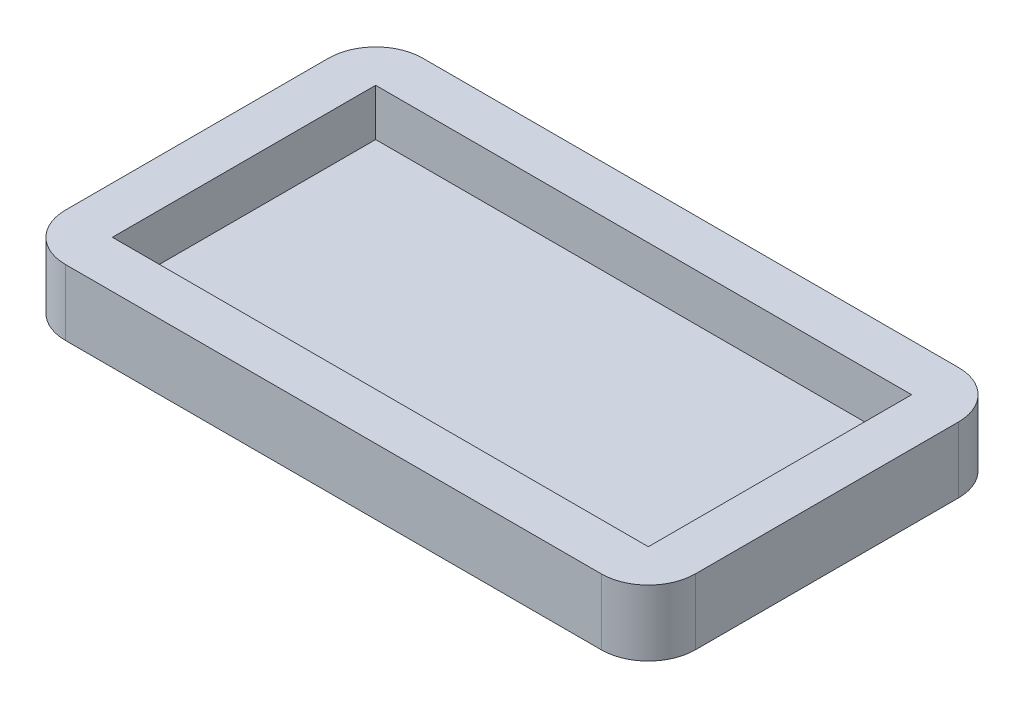
ISO-10303-21;
HEADER;
FILE_DESCRIPTION(('STEP AP214'),'2;1');
FILE_NAME('part.step','',(''),(''),'','','');
FILE_SCHEMA(('AUTOMOTIVE_DESIGN { 1 0 10303 214 1 1 1 1 }'));
ENDSEC;
DATA;
#1=APPLICATION_CONTEXT('core data for automotive mechanical design processes');
#2=APPLICATION_PROTOCOL_DEFINITION('international standard','automotive_design',2000,#1);
#3=PRODUCT_CONTEXT('',#1,'mechanical');
#4=PRODUCT('Part','Part','',(#3));
#5=PRODUCT_RELATED_PRODUCT_CATEGORY('part','',(#4));
#6=PRODUCT_DEFINITION_FORMATION('','',#4);
#7=PRODUCT_DEFINITION_CONTEXT('part definition',#1,'design');
#8=PRODUCT_DEFINITION('design','',#6,#7);
#9=PRODUCT_DEFINITION_SHAPE('','',#8);
#10=(LENGTH_UNIT() NAMED_UNIT(*) SI_UNIT(.MILLI.,.METRE.));
#11=(NAMED_UNIT(*) PLANE_ANGLE_UNIT() SI_UNIT($,.RADIAN.));
#12=(NAMED_UNIT(*) SI_UNIT($,.STERADIAN.) SOLID_ANGLE_UNIT());
#13=UNCERTAINTY_MEASURE_WITH_UNIT(LENGTH_MEASURE(1.E-05),#10,'distance_accuracy_value','');
#14=(GEOMETRIC_REPRESENTATION_CONTEXT(3) GLOBAL_UNCERTAINTY_ASSIGNED_CONTEXT((#13)) GLOBAL_UNIT_ASSIGNED_CONTEXT((#10,
#11,#12)) REPRESENTATION_CONTEXT('',''));
#15=CARTESIAN_POINT('',(0.,0.,0.));
#16=DIRECTION('',(0.,0.,1.));
#17=DIRECTION('',(1.,0.,0.));
#18=AXIS2_PLACEMENT_3D('',#15,#16,#17);
#19=CARTESIAN_POINT('',(-38.6259379929306,7.,-12.3630930746685));
#20=DIRECTION('',(0.,-1.,0.));
#21=DIRECTION('',(0.,0.,-1.));
#22=AXIS2_PLACEMENT_3D('',#19,#20,#21);
#23=CYLINDRICAL_SURFACE('',#22,5.);
#24=CARTESIAN_POINT('',(-38.6259379929306,0.,-12.3630930746685));
#25=DIRECTION('',(0.,1.,0.));
#26=DIRECTION('',(0.,0.,1.));
#27=AXIS2_PLACEMENT_3D('',#24,#25,#26);
#28=CIRCLE('',#27,5.);
#29=CARTESIAN_POINT('',(-43.6259379929306,0.,-12.3630930746685));
#30=VERTEX_POINT('',#29);
#31=CARTESIAN_POINT('',(-38.6259379929306,0.,-17.3630930746685));
#32=VERTEX_POINT('',#31);
#33=EDGE_CURVE('E149',#30,#32,#28,.F.);
#34=ORIENTED_EDGE('',*,*,#33,.F.);
#35=DIRECTION('',(0.,-1.,0.));
#36=VECTOR('',#35,1.);
#37=CARTESIAN_POINT('',(-43.6259379929306,7.,-12.3630930746685));
#38=LINE('',#37,#36);
#39=CARTESIAN_POINT('',(-43.6259379929306,7.,-12.3630930746685));
#40=VERTEX_POINT('',#39);
#41=EDGE_CURVE('E11',#40,#30,#38,.T.);
#42=ORIENTED_EDGE('',*,*,#41,.F.);
#43=CARTESIAN_POINT('',(-38.6259379929306,7.,-12.3630930746685));
#44=DIRECTION('',(0.,1.,0.));
#45=DIRECTION('',(0.,0.,1.));
#46=AXIS2_PLACEMENT_3D('',#43,#44,#45);
#47=CIRCLE('',#46,5.);
#48=CARTESIAN_POINT('',(-38.6259379929306,7.,-17.3630930746685));
#49=VERTEX_POINT('',#48);
#50=EDGE_CURVE('E170',#40,#49,#47,.F.);
#51=ORIENTED_EDGE('',*,*,#50,.T.);
#52=DIRECTION('',(0.,-1.,0.));
#53=VECTOR('',#52,1.);
#54=CARTESIAN_POINT('',(-38.6259379929306,7.,-17.3630930746685));
#55=LINE('',#54,#53);
#56=EDGE_CURVE('E63',#49,#32,#55,.T.);
#57=ORIENTED_EDGE('',*,*,#56,.T.);
#58=EDGE_LOOP('',(#34,#42,#51,#57));
#59=FACE_BOUND('',#58,.T.);
#60=ADVANCED_FACE('F41',(#59),#23,.T.);
#61=CARTESIAN_POINT('',(-43.6259379929306,7.,0.));
#62=DIRECTION('',(1.,0.,0.));
#63=DIRECTION('',(0.,0.,-1.));
#64=AXIS2_PLACEMENT_3D('',#61,#62,#63);
#65=PLANE('',#64);
#66=DIRECTION('',(0.,0.,1.));
#67=VECTOR('',#66,1.);
#68=CARTESIAN_POINT('',(-43.6259379929306,0.,0.));
#69=LINE('',#68,#67);
#70=CARTESIAN_POINT('',(-43.6259379929306,0.,15.6369069253315));
#71=VERTEX_POINT('',#70);
#72=EDGE_CURVE('E151',#30,#71,#69,.T.);
#73=ORIENTED_EDGE('',*,*,#72,.T.);
#74=DIRECTION('',(0.,-1.,0.));
#75=VECTOR('',#74,1.);
#76=CARTESIAN_POINT('',(-43.6259379929306,7.,15.6369069253315));
#77=LINE('',#76,#75);
#78=CARTESIAN_POINT('',(-43.6259379929306,7.,15.6369069253315));
#79=VERTEX_POINT('',#78);
#80=EDGE_CURVE('E48',#79,#71,#77,.T.);
#81=ORIENTED_EDGE('',*,*,#80,.F.);
#82=DIRECTION('',(0.,0.,1.));
#83=VECTOR('',#82,1.);
#84=CARTESIAN_POINT('',(-43.6259379929306,7.,0.));
#85=LINE('',#84,#83);
#86=EDGE_CURVE('E197',#40,#79,#85,.T.);
#87=ORIENTED_EDGE('',*,*,#86,.F.);
#88=ORIENTED_EDGE('',*,*,#41,.T.);
#89=EDGE_LOOP('',(#73,#81,#87,#88));
#90=FACE_BOUND('',#89,.T.);
#91=ADVANCED_FACE('F275',(#90),#65,.F.);
#92=CARTESIAN_POINT('',(-38.6259379929306,7.,15.6369069253315));
#93=DIRECTION('',(0.,-1.,0.));
#94=DIRECTION('',(0.,0.,-1.));
#95=AXIS2_PLACEMENT_3D('',#92,#93,#94);
#96=CYLINDRICAL_SURFACE('',#95,5.);
#97=CARTESIAN_POINT('',(-38.6259379929306,0.,15.6369069253315));
#98=DIRECTION('',(0.,1.,0.));
#99=DIRECTION('',(0.,0.,1.));
#100=AXIS2_PLACEMENT_3D('',#97,#98,#99);
#101=CIRCLE('',#100,5.);
#102=CARTESIAN_POINT('',(-38.6259379929306,0.,20.6369069253315));
#103=VERTEX_POINT('',#102);
#104=EDGE_CURVE('E152',#71,#103,#101,.T.);
#105=ORIENTED_EDGE('',*,*,#104,.T.);
#106=DIRECTION('',(0.,-1.,0.));
#107=VECTOR('',#106,1.);
#108=CARTESIAN_POINT('',(-38.6259379929306,7.,20.6369069253315));
#109=LINE('',#108,#107);
#110=CARTESIAN_POINT('',(-38.6259379929306,7.,20.6369069253315));
#111=VERTEX_POINT('',#110);
#112=EDGE_CURVE('E173',#111,#103,#109,.T.);
#113=ORIENTED_EDGE('',*,*,#112,.F.);
#114=CARTESIAN_POINT('',(-38.6259379929306,7.,15.6369069253315));
#115=DIRECTION('',(0.,1.,0.));
#116=DIRECTION('',(0.,0.,1.));
#117=AXIS2_PLACEMENT_3D('',#114,#115,#116);
#118=CIRCLE('',#117,5.);
#119=EDGE_CURVE('E181',#79,#111,#118,.T.);
#120=ORIENTED_EDGE('',*,*,#119,.F.);
#121=ORIENTED_EDGE('',*,*,#80,.T.);
#122=EDGE_LOOP('',(#105,#113,#120,#121));
#123=FACE_BOUND('',#122,.T.);
#124=ADVANCED_FACE('F182',(#123),#96,.T.);
#125=CARTESIAN_POINT('',(0.,7.,20.6369069253315));
#126=DIRECTION('',(0.,0.,-1.));
#127=DIRECTION('',(-1.,0.,0.));
#128=AXIS2_PLACEMENT_3D('',#125,#126,#127);
#129=PLANE('',#128);
#130=DIRECTION('',(1.,0.,0.));
#131=VECTOR('',#130,1.);
#132=CARTESIAN_POINT('',(0.,0.,20.6369069253315));
#133=LINE('',#132,#131);
#134=CARTESIAN_POINT('',(18.3740620070691,0.,20.6369069253315));
#135=VERTEX_POINT('',#134);
#136=EDGE_CURVE('E156',#103,#135,#133,.T.);
#137=ORIENTED_EDGE('',*,*,#136,.T.);
#138=DIRECTION('',(0.,-1.,0.));
#139=VECTOR('',#138,1.);
#140=CARTESIAN_POINT('',(18.3740620070691,7.,20.6369069253315));
#141=LINE('',#140,#139);
#142=CARTESIAN_POINT('',(18.3740620070691,7.,20.6369069253315));
#143=VERTEX_POINT('',#142);
#144=EDGE_CURVE('E174',#143,#135,#141,.T.);
#145=ORIENTED_EDGE('',*,*,#144,.F.);
#146=DIRECTION('',(1.,0.,0.));
#147=VECTOR('',#146,1.);
#148=CARTESIAN_POINT('',(0.,7.,20.6369069253315));
#149=LINE('',#148,#147);
#150=EDGE_CURVE('E145',#111,#143,#149,.T.);
#151=ORIENTED_EDGE('',*,*,#150,.F.);
#152=ORIENTED_EDGE('',*,*,#112,.T.);
#153=EDGE_LOOP('',(#137,#145,#151,#152));
#154=FACE_BOUND('',#153,.T.);
#155=ADVANCED_FACE('F195',(#154),#129,.F.);
#156=CARTESIAN_POINT('',(18.3740620070691,7.,15.6369069253315));
#157=DIRECTION('',(0.,-1.,0.));
#158=DIRECTION('',(0.,0.,-1.));
#159=AXIS2_PLACEMENT_3D('',#156,#157,#158);
#160=CYLINDRICAL_SURFACE('',#159,5.);
#161=CARTESIAN_POINT('',(18.3740620070691,0.,15.6369069253315));
#162=DIRECTION('',(0.,1.,0.));
#163=DIRECTION('',(0.,0.,1.));
#164=AXIS2_PLACEMENT_3D('',#161,#162,#163);
#165=CIRCLE('',#164,5.);
#166=CARTESIAN_POINT('',(23.3740620070691,0.,15.6369069253315));
#167=VERTEX_POINT('',#166);
#168=EDGE_CURVE('E158',#135,#167,#165,.T.);
#169=ORIENTED_EDGE('',*,*,#168,.T.);
#170=DIRECTION('',(0.,-1.,0.));
#171=VECTOR('',#170,1.);
#172=CARTESIAN_POINT('',(23.3740620070691,7.,15.6369069253315));
#173=LINE('',#172,#171);
#174=CARTESIAN_POINT('',(23.3740620070691,7.,15.6369069253315));
#175=VERTEX_POINT('',#174);
#176=EDGE_CURVE('E126',#175,#167,#173,.T.);
#177=ORIENTED_EDGE('',*,*,#176,.F.);
#178=CARTESIAN_POINT('',(18.3740620070691,7.,15.6369069253315));
#179=DIRECTION('',(0.,1.,0.));
#180=DIRECTION('',(0.,0.,1.));
#181=AXIS2_PLACEMENT_3D('',#178,#179,#180);
#182=CIRCLE('',#181,5.);
#183=EDGE_CURVE('E143',#143,#175,#182,.T.);
#184=ORIENTED_EDGE('',*,*,#183,.F.);
#185=ORIENTED_EDGE('',*,*,#144,.T.);
#186=EDGE_LOOP('',(#169,#177,#184,#185));
#187=FACE_BOUND('',#186,.T.);
#188=ADVANCED_FACE('F193',(#187),#160,.T.);
#189=CARTESIAN_POINT('',(23.3740620070691,7.,0.));
#190=DIRECTION('',(1.,0.,0.));
#191=DIRECTION('',(0.,0.,-1.));
#192=AXIS2_PLACEMENT_3D('',#189,#190,#191);
#193=PLANE('',#192);
#194=DIRECTION('',(0.,0.,1.));
#195=VECTOR('',#194,1.);
#196=CARTESIAN_POINT('',(23.3740620070691,0.,0.));
#197=LINE('',#196,#195);
#198=CARTESIAN_POINT('',(23.3740620070691,0.,-12.3630930746685));
#199=VERTEX_POINT('',#198);
#200=EDGE_CURVE('E124',#199,#167,#197,.T.);
#201=ORIENTED_EDGE('',*,*,#200,.F.);
#202=DIRECTION('',(0.,-1.,0.));
#203=VECTOR('',#202,1.);
#204=CARTESIAN_POINT('',(23.3740620070691,7.,-12.3630930746685));
#205=LINE('',#204,#203);
#206=CARTESIAN_POINT('',(23.3740620070691,7.,-12.3630930746685));
#207=VERTEX_POINT('',#206);
#208=EDGE_CURVE('E120',#207,#199,#205,.T.);
#209=ORIENTED_EDGE('',*,*,#208,.F.);
#210=DIRECTION('',(0.,0.,1.));
#211=VECTOR('',#210,1.);
#212=CARTESIAN_POINT('',(23.3740620070691,7.,0.));
#213=LINE('',#212,#211);
#214=EDGE_CURVE('E125',#207,#175,#213,.T.);
#215=ORIENTED_EDGE('',*,*,#214,.T.);
#216=ORIENTED_EDGE('',*,*,#176,.T.);
#217=EDGE_LOOP('',(#201,#209,#215,#216));
#218=FACE_BOUND('',#217,.T.);
#219=ADVANCED_FACE('F117',(#218),#193,.T.);
#220=CARTESIAN_POINT('',(18.3740620070691,7.,-12.3630930746685));
#221=DIRECTION('',(0.,-1.,0.));
#222=DIRECTION('',(0.,0.,-1.));
#223=AXIS2_PLACEMENT_3D('',#220,#221,#222);
#224=CYLINDRICAL_SURFACE('',#223,5.);
#225=CARTESIAN_POINT('',(18.3740620070691,0.,-12.3630930746685));
#226=DIRECTION('',(0.,1.,0.));
#227=DIRECTION('',(0.,0.,1.));
#228=AXIS2_PLACEMENT_3D('',#225,#226,#227);
#229=CIRCLE('',#228,5.);
#230=CARTESIAN_POINT('',(18.3740620070691,0.,-17.3630930746685));
#231=VERTEX_POINT('',#230);
#232=EDGE_CURVE('E165',#199,#231,#229,.T.);
#233=ORIENTED_EDGE('',*,*,#232,.T.);
#234=DIRECTION('',(0.,-1.,0.));
#235=VECTOR('',#234,1.);
#236=CARTESIAN_POINT('',(18.3740620070691,7.,-17.3630930746685));
#237=LINE('',#236,#235);
#238=CARTESIAN_POINT('',(18.3740620070691,7.,-17.3630930746685));
#239=VERTEX_POINT('',#238);
#240=EDGE_CURVE('E129',#239,#231,#237,.T.);
#241=ORIENTED_EDGE('',*,*,#240,.F.);
#242=CARTESIAN_POINT('',(18.3740620070691,7.,-12.3630930746685));
#243=DIRECTION('',(0.,1.,0.));
#244=DIRECTION('',(0.,0.,1.));
#245=AXIS2_PLACEMENT_3D('',#242,#243,#244);
#246=CIRCLE('',#245,5.);
#247=EDGE_CURVE('E131',#207,#239,#246,.T.);
#248=ORIENTED_EDGE('',*,*,#247,.F.);
#249=ORIENTED_EDGE('',*,*,#208,.T.);
#250=EDGE_LOOP('',(#233,#241,#248,#249));
#251=FACE_BOUND('',#250,.T.);
#252=ADVANCED_FACE('F135',(#251),#224,.T.);
#253=CARTESIAN_POINT('',(0.,7.,-17.3630930746685));
#254=DIRECTION('',(0.,0.,-1.));
#255=DIRECTION('',(-1.,0.,0.));
#256=AXIS2_PLACEMENT_3D('',#253,#254,#255);
#257=PLANE('',#256);
#258=DIRECTION('',(1.,0.,0.));
#259=VECTOR('',#258,1.);
#260=CARTESIAN_POINT('',(0.,0.,-17.3630930746685));
#261=LINE('',#260,#259);
#262=EDGE_CURVE('E163',#32,#231,#261,.T.);
#263=ORIENTED_EDGE('',*,*,#262,.F.);
#264=ORIENTED_EDGE('',*,*,#56,.F.);
#265=DIRECTION('',(1.,0.,0.));
#266=VECTOR('',#265,1.);
#267=CARTESIAN_POINT('',(0.,7.,-17.3630930746685));
#268=LINE('',#267,#266);
#269=EDGE_CURVE('E137',#49,#239,#268,.T.);
#270=ORIENTED_EDGE('',*,*,#269,.T.);
#271=ORIENTED_EDGE('',*,*,#240,.T.);
#272=EDGE_LOOP('',(#263,#264,#270,#271));
#273=FACE_BOUND('',#272,.T.);
#274=ADVANCED_FACE('F198',(#273),#257,.T.);
#275=CARTESIAN_POINT('',(0.,7.,0.));
#276=DIRECTION('',(0.,1.,0.));
#277=DIRECTION('',(0.,0.,1.));
#278=AXIS2_PLACEMENT_3D('',#275,#276,#277);
#279=PLANE('',#278);
#280=DIRECTION('',(0.,0.,1.));
#281=VECTOR('',#280,1.);
#282=CARTESIAN_POINT('',(-38.6259379929306,7.,-12.3630930746685));
#283=LINE('',#282,#281);
#284=CARTESIAN_POINT('',(-38.6259379929306,7.,-12.3630930746685));
#285=VERTEX_POINT('',#284);
#286=CARTESIAN_POINT('',(-38.6259379929306,7.,15.6369069253315));
#287=VERTEX_POINT('',#286);
#288=EDGE_CURVE('E54',#285,#287,#283,.T.);
#289=ORIENTED_EDGE('',*,*,#288,.F.);
#290=DIRECTION('',(-1.,0.,0.));
#291=VECTOR('',#290,1.);
#292=CARTESIAN_POINT('',(-38.6259379929306,7.,-12.3630930746685));
#293=LINE('',#292,#291);
#294=CARTESIAN_POINT('',(18.3740620070694,7.,-12.3630930746685));
#295=VERTEX_POINT('',#294);
#296=EDGE_CURVE('E215',#295,#285,#293,.T.);
#297=ORIENTED_EDGE('',*,*,#296,.F.);
#298=DIRECTION('',(0.,0.,-1.));
#299=VECTOR('',#298,1.);
#300=CARTESIAN_POINT('',(18.3740620070694,7.,-12.3630930746685));
#301=LINE('',#300,#299);
#302=CARTESIAN_POINT('',(18.3740620070694,7.,15.6369069253315));
#303=VERTEX_POINT('',#302);
#304=EDGE_CURVE('E216',#303,#295,#301,.T.);
#305=ORIENTED_EDGE('',*,*,#304,.F.);
#306=DIRECTION('',(1.,0.,0.));
#307=VECTOR('',#306,1.);
#308=CARTESIAN_POINT('',(-38.6259379929306,7.,15.6369069253315));
#309=LINE('',#308,#307);
#310=EDGE_CURVE('E218',#287,#303,#309,.T.);
#311=ORIENTED_EDGE('',*,*,#310,.F.);
#312=EDGE_LOOP('',(#289,#297,#305,#311));
#313=FACE_BOUND('',#312,.T.);
#314=ORIENTED_EDGE('',*,*,#50,.F.);
#315=ORIENTED_EDGE('',*,*,#86,.T.);
#316=ORIENTED_EDGE('',*,*,#119,.T.);
#317=ORIENTED_EDGE('',*,*,#150,.T.);
#318=ORIENTED_EDGE('',*,*,#183,.T.);
#319=ORIENTED_EDGE('',*,*,#214,.F.);
#320=ORIENTED_EDGE('',*,*,#247,.T.);
#321=ORIENTED_EDGE('',*,*,#269,.F.);
#322=EDGE_LOOP('',(#314,#315,#316,#317,#318,#319,#320,#321));
#323=FACE_BOUND('',#322,.T.);
#324=ADVANCED_FACE('F136',(#313,#323),#279,.T.);
#325=CARTESIAN_POINT('',(0.,0.,0.));
#326=DIRECTION('',(0.,1.,0.));
#327=DIRECTION('',(0.,0.,1.));
#328=AXIS2_PLACEMENT_3D('',#325,#326,#327);
#329=PLANE('',#328);
#330=ORIENTED_EDGE('',*,*,#33,.T.);
#331=ORIENTED_EDGE('',*,*,#262,.T.);
#332=ORIENTED_EDGE('',*,*,#232,.F.);
#333=ORIENTED_EDGE('',*,*,#200,.T.);
#334=ORIENTED_EDGE('',*,*,#168,.F.);
#335=ORIENTED_EDGE('',*,*,#136,.F.);
#336=ORIENTED_EDGE('',*,*,#104,.F.);
#337=ORIENTED_EDGE('',*,*,#72,.F.);
#338=EDGE_LOOP('',(#330,#331,#332,#333,#334,#335,#336,#337));
#339=FACE_BOUND('',#338,.T.);
#340=ADVANCED_FACE('F190',(#339),#329,.F.);
#341=CARTESIAN_POINT('',(-38.6259379929306,2.,-12.3630930746685));
#342=DIRECTION('',(-1.,0.,0.));
#343=DIRECTION('',(0.,0.,1.));
#344=AXIS2_PLACEMENT_3D('',#341,#342,#343);
#345=PLANE('',#344);
#346=ORIENTED_EDGE('',*,*,#288,.T.);
#347=DIRECTION('',(0.,1.,0.));
#348=VECTOR('',#347,1.);
#349=CARTESIAN_POINT('',(-38.6259379929306,2.,15.6369069253315));
#350=LINE('',#349,#348);
#351=CARTESIAN_POINT('',(-38.6259379929306,2.,15.6369069253315));
#352=VERTEX_POINT('',#351);
#353=EDGE_CURVE('E203',#352,#287,#350,.T.);
#354=ORIENTED_EDGE('',*,*,#353,.F.);
#355=DIRECTION('',(0.,0.,1.));
#356=VECTOR('',#355,1.);
#357=CARTESIAN_POINT('',(-38.6259379929306,2.,-12.3630930746685));
#358=LINE('',#357,#356);
#359=CARTESIAN_POINT('',(-38.6259379929306,2.,-12.3630930746685));
#360=VERTEX_POINT('',#359);
#361=EDGE_CURVE('E214',#360,#352,#358,.T.);
#362=ORIENTED_EDGE('',*,*,#361,.F.);
#363=DIRECTION('',(0.,1.,0.));
#364=VECTOR('',#363,1.);
#365=CARTESIAN_POINT('',(-38.6259379929306,2.,-12.3630930746685));
#366=LINE('',#365,#364);
#367=EDGE_CURVE('E155',#360,#285,#366,.T.);
#368=ORIENTED_EDGE('',*,*,#367,.T.);
#369=EDGE_LOOP('',(#346,#354,#362,#368));
#370=FACE_BOUND('',#369,.T.);
#371=ADVANCED_FACE('F238',(#370),#345,.F.);
#372=CARTESIAN_POINT('',(-38.6259379929306,2.,-12.3630930746685));
#373=DIRECTION('',(0.,0.,-1.));
#374=DIRECTION('',(-1.,0.,0.));
#375=AXIS2_PLACEMENT_3D('',#372,#373,#374);
#376=PLANE('',#375);
#377=ORIENTED_EDGE('',*,*,#296,.T.);
#378=ORIENTED_EDGE('',*,*,#367,.F.);
#379=DIRECTION('',(-1.,0.,0.));
#380=VECTOR('',#379,1.);
#381=CARTESIAN_POINT('',(-38.6259379929306,2.,-12.3630930746685));
#382=LINE('',#381,#380);
#383=CARTESIAN_POINT('',(18.3740620070694,2.,-12.3630930746685));
#384=VERTEX_POINT('',#383);
#385=EDGE_CURVE('E202',#384,#360,#382,.T.);
#386=ORIENTED_EDGE('',*,*,#385,.F.);
#387=DIRECTION('',(0.,1.,0.));
#388=VECTOR('',#387,1.);
#389=CARTESIAN_POINT('',(18.3740620070694,2.,-12.3630930746685));
#390=LINE('',#389,#388);
#391=EDGE_CURVE('E208',#384,#295,#390,.T.);
#392=ORIENTED_EDGE('',*,*,#391,.T.);
#393=EDGE_LOOP('',(#377,#378,#386,#392));
#394=FACE_BOUND('',#393,.T.);
#395=ADVANCED_FACE('F253',(#394),#376,.F.);
#396=CARTESIAN_POINT('',(18.3740620070694,2.,-12.3630930746685));
#397=DIRECTION('',(1.,0.,0.));
#398=DIRECTION('',(0.,0.,-1.));
#399=AXIS2_PLACEMENT_3D('',#396,#397,#398);
#400=PLANE('',#399);
#401=ORIENTED_EDGE('',*,*,#304,.T.);
#402=ORIENTED_EDGE('',*,*,#391,.F.);
#403=DIRECTION('',(0.,0.,-1.));
#404=VECTOR('',#403,1.);
#405=CARTESIAN_POINT('',(18.3740620070694,2.,-12.3630930746685));
#406=LINE('',#405,#404);
#407=CARTESIAN_POINT('',(18.3740620070694,2.,15.6369069253315));
#408=VERTEX_POINT('',#407);
#409=EDGE_CURVE('E223',#408,#384,#406,.T.);
#410=ORIENTED_EDGE('',*,*,#409,.F.);
#411=DIRECTION('',(0.,1.,0.));
#412=VECTOR('',#411,1.);
#413=CARTESIAN_POINT('',(18.3740620070694,2.,15.6369069253315));
#414=LINE('',#413,#412);
#415=EDGE_CURVE('E204',#408,#303,#414,.T.);
#416=ORIENTED_EDGE('',*,*,#415,.T.);
#417=EDGE_LOOP('',(#401,#402,#410,#416));
#418=FACE_BOUND('',#417,.T.);
#419=ADVANCED_FACE('F258',(#418),#400,.F.);
#420=CARTESIAN_POINT('',(-38.6259379929306,2.,15.6369069253315));
#421=DIRECTION('',(0.,0.,1.));
#422=DIRECTION('',(1.,0.,0.));
#423=AXIS2_PLACEMENT_3D('',#420,#421,#422);
#424=PLANE('',#423);
#425=ORIENTED_EDGE('',*,*,#310,.T.);
#426=ORIENTED_EDGE('',*,*,#415,.F.);
#427=DIRECTION('',(1.,0.,0.));
#428=VECTOR('',#427,1.);
#429=CARTESIAN_POINT('',(-38.6259379929306,2.,15.6369069253315));
#430=LINE('',#429,#428);
#431=EDGE_CURVE('E230',#352,#408,#430,.T.);
#432=ORIENTED_EDGE('',*,*,#431,.F.);
#433=ORIENTED_EDGE('',*,*,#353,.T.);
#434=EDGE_LOOP('',(#425,#426,#432,#433));
#435=FACE_BOUND('',#434,.T.);
#436=ADVANCED_FACE('F261',(#435),#424,.F.);
#437=CARTESIAN_POINT('',(0.,2.,0.));
#438=DIRECTION('',(0.,1.,0.));
#439=DIRECTION('',(0.,0.,1.));
#440=AXIS2_PLACEMENT_3D('',#437,#438,#439);
#441=PLANE('',#440);
#442=ORIENTED_EDGE('',*,*,#361,.T.);
#443=ORIENTED_EDGE('',*,*,#431,.T.);
#444=ORIENTED_EDGE('',*,*,#409,.T.);
#445=ORIENTED_EDGE('',*,*,#385,.T.);
#446=EDGE_LOOP('',(#442,#443,#444,#445));
#447=FACE_BOUND('',#446,.T.);
#448=ADVANCED_FACE('F231',(#447),#441,.T.);
#449=CLOSED_SHELL('',(#60,#91,#124,#155,#188,#219,#252,#274,#324,#340,#371,#395,#419,#436,#448));
#450=MANIFOLD_SOLID_BREP('B2',#449);
#451=ADVANCED_BREP_SHAPE_REPRESENTATION('',(#18,#450),#14);
#452=SHAPE_DEFINITION_REPRESENTATION(#9,#451);
ENDSEC;
END-ISO-10303-21;
